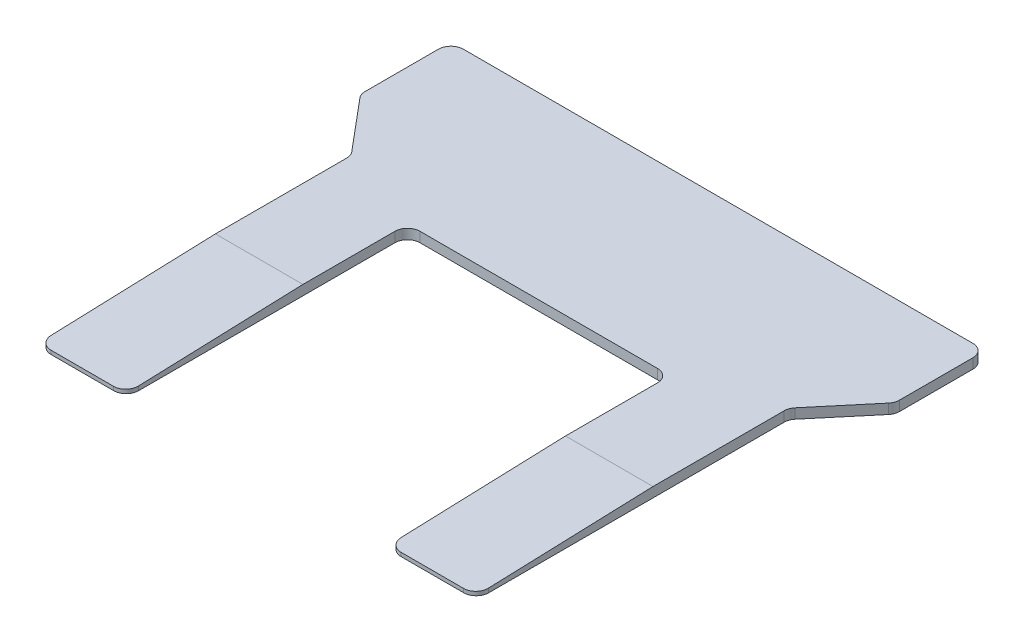
ISO-10303-21;
HEADER;
FILE_DESCRIPTION(('STEP AP214'),'2;1');
FILE_NAME('part.step','',(''),(''),'','','');
FILE_SCHEMA(('AUTOMOTIVE_DESIGN { 1 0 10303 214 1 1 1 1 }'));
ENDSEC;
DATA;
#1=APPLICATION_CONTEXT('core data for automotive mechanical design processes');
#2=APPLICATION_PROTOCOL_DEFINITION('international standard','automotive_design',2000,#1);
#3=PRODUCT_CONTEXT('',#1,'mechanical');
#4=PRODUCT('Part','Part','',(#3));
#5=PRODUCT_RELATED_PRODUCT_CATEGORY('part','',(#4));
#6=PRODUCT_DEFINITION_FORMATION('','',#4);
#7=PRODUCT_DEFINITION_CONTEXT('part definition',#1,'design');
#8=PRODUCT_DEFINITION('design','',#6,#7);
#9=PRODUCT_DEFINITION_SHAPE('','',#8);
#10=(LENGTH_UNIT() NAMED_UNIT(*) SI_UNIT(.MILLI.,.METRE.));
#11=(NAMED_UNIT(*) PLANE_ANGLE_UNIT() SI_UNIT($,.RADIAN.));
#12=(NAMED_UNIT(*) SI_UNIT($,.STERADIAN.) SOLID_ANGLE_UNIT());
#13=UNCERTAINTY_MEASURE_WITH_UNIT(LENGTH_MEASURE(1.E-05),#10,'distance_accuracy_value','');
#14=(GEOMETRIC_REPRESENTATION_CONTEXT(3) GLOBAL_UNCERTAINTY_ASSIGNED_CONTEXT((#13)) GLOBAL_UNIT_ASSIGNED_CONTEXT((#10,
#11,#12)) REPRESENTATION_CONTEXT('',''));
#15=CARTESIAN_POINT('',(0.,0.,0.));
#16=DIRECTION('',(0.,0.,1.));
#17=DIRECTION('',(1.,0.,0.));
#18=AXIS2_PLACEMENT_3D('',#15,#16,#17);
#19=CARTESIAN_POINT('',(-19.,1.5875,30.7));
#20=DIRECTION('',(0.,-1.,0.));
#21=DIRECTION('',(0.,0.,-1.));
#22=AXIS2_PLACEMENT_3D('',#19,#20,#21);
#23=CYLINDRICAL_SURFACE('',#22,2.);
#24=CARTESIAN_POINT('',(-19.,0.,30.7));
#25=DIRECTION('',(0.,-1.,0.));
#26=DIRECTION('',(0.,0.,-1.));
#27=AXIS2_PLACEMENT_3D('',#24,#25,#26);
#28=CIRCLE('',#27,2.);
#29=CARTESIAN_POINT('',(-21.,0.,30.7));
#30=VERTEX_POINT('',#29);
#31=CARTESIAN_POINT('',(-19.,0.,28.7));
#32=VERTEX_POINT('',#31);
#33=EDGE_CURVE('E336',#30,#32,#28,.T.);
#34=ORIENTED_EDGE('',*,*,#33,.T.);
#35=DIRECTION('',(0.,-1.,0.));
#36=VECTOR('',#35,1.);
#37=CARTESIAN_POINT('',(-19.,1.5875,28.7));
#38=LINE('',#37,#36);
#39=CARTESIAN_POINT('',(-19.,1.5875,28.7));
#40=VERTEX_POINT('',#39);
#41=EDGE_CURVE('E285',#40,#32,#38,.T.);
#42=ORIENTED_EDGE('',*,*,#41,.F.);
#43=CARTESIAN_POINT('',(-19.,1.5875,30.7));
#44=DIRECTION('',(0.,-1.,0.));
#45=DIRECTION('',(0.,0.,-1.));
#46=AXIS2_PLACEMENT_3D('',#43,#44,#45);
#47=CIRCLE('',#46,2.);
#48=CARTESIAN_POINT('',(-21.,1.5875,30.7));
#49=VERTEX_POINT('',#48);
#50=EDGE_CURVE('E390',#49,#40,#47,.T.);
#51=ORIENTED_EDGE('',*,*,#50,.F.);
#52=DIRECTION('',(0.,-1.,0.));
#53=VECTOR('',#52,1.);
#54=CARTESIAN_POINT('',(-21.,1.5875,30.7));
#55=LINE('',#54,#53);
#56=EDGE_CURVE('E335',#49,#30,#55,.T.);
#57=ORIENTED_EDGE('',*,*,#56,.T.);
#58=EDGE_LOOP('',(#34,#42,#51,#57));
#59=FACE_BOUND('',#58,.T.);
#60=ADVANCED_FACE('F35',(#59),#23,.F.);
#61=CARTESIAN_POINT('',(-19.,1.5875,28.7));
#62=DIRECTION('',(0.,0.,-1.));
#63=DIRECTION('',(-1.,0.,0.));
#64=AXIS2_PLACEMENT_3D('',#61,#62,#63);
#65=PLANE('',#64);
#66=DIRECTION('',(1.,0.,0.));
#67=VECTOR('',#66,1.);
#68=CARTESIAN_POINT('',(-19.,0.,28.7));
#69=LINE('',#68,#67);
#70=CARTESIAN_POINT('',(19.,0.,28.7));
#71=VERTEX_POINT('',#70);
#72=EDGE_CURVE('E338',#32,#71,#69,.T.);
#73=ORIENTED_EDGE('',*,*,#72,.T.);
#74=DIRECTION('',(0.,-1.,0.));
#75=VECTOR('',#74,1.);
#76=CARTESIAN_POINT('',(19.,1.5875,28.7));
#77=LINE('',#76,#75);
#78=CARTESIAN_POINT('',(19.,1.5875,28.7));
#79=VERTEX_POINT('',#78);
#80=EDGE_CURVE('E283',#79,#71,#77,.T.);
#81=ORIENTED_EDGE('',*,*,#80,.F.);
#82=DIRECTION('',(1.,0.,0.));
#83=VECTOR('',#82,1.);
#84=CARTESIAN_POINT('',(-19.,1.5875,28.7));
#85=LINE('',#84,#83);
#86=EDGE_CURVE('E423',#40,#79,#85,.T.);
#87=ORIENTED_EDGE('',*,*,#86,.F.);
#88=ORIENTED_EDGE('',*,*,#41,.T.);
#89=EDGE_LOOP('',(#73,#81,#87,#88));
#90=FACE_BOUND('',#89,.T.);
#91=ADVANCED_FACE('F513',(#90),#65,.F.);
#92=CARTESIAN_POINT('',(19.,1.5875,30.7));
#93=DIRECTION('',(0.,-1.,0.));
#94=DIRECTION('',(0.,0.,-1.));
#95=AXIS2_PLACEMENT_3D('',#92,#93,#94);
#96=CYLINDRICAL_SURFACE('',#95,2.);
#97=CARTESIAN_POINT('',(19.,0.,30.7));
#98=DIRECTION('',(0.,-1.,0.));
#99=DIRECTION('',(0.,0.,-1.));
#100=AXIS2_PLACEMENT_3D('',#97,#98,#99);
#101=CIRCLE('',#100,2.);
#102=CARTESIAN_POINT('',(21.,0.,30.7));
#103=VERTEX_POINT('',#102);
#104=EDGE_CURVE('E341',#71,#103,#101,.T.);
#105=ORIENTED_EDGE('',*,*,#104,.T.);
#106=DIRECTION('',(0.,-1.,0.));
#107=VECTOR('',#106,1.);
#108=CARTESIAN_POINT('',(21.,1.5875,30.7));
#109=LINE('',#108,#107);
#110=CARTESIAN_POINT('',(21.,1.5875,30.7));
#111=VERTEX_POINT('',#110);
#112=EDGE_CURVE('E280',#111,#103,#109,.T.);
#113=ORIENTED_EDGE('',*,*,#112,.F.);
#114=CARTESIAN_POINT('',(19.,1.5875,30.7));
#115=DIRECTION('',(0.,-1.,0.));
#116=DIRECTION('',(0.,0.,-1.));
#117=AXIS2_PLACEMENT_3D('',#114,#115,#116);
#118=CIRCLE('',#117,2.);
#119=EDGE_CURVE('E308',#79,#111,#118,.T.);
#120=ORIENTED_EDGE('',*,*,#119,.F.);
#121=ORIENTED_EDGE('',*,*,#80,.T.);
#122=EDGE_LOOP('',(#105,#113,#120,#121));
#123=FACE_BOUND('',#122,.T.);
#124=ADVANCED_FACE('F428',(#123),#96,.F.);
#125=CARTESIAN_POINT('',(21.,1.5875,30.7));
#126=DIRECTION('',(1.,0.,0.));
#127=DIRECTION('',(0.,0.,-1.));
#128=AXIS2_PLACEMENT_3D('',#125,#126,#127);
#129=PLANE('',#128);
#130=DIRECTION('',(0.,-1.,0.));
#131=VECTOR('',#130,1.);
#132=CARTESIAN_POINT('',(21.,1.5875,71.7));
#133=LINE('',#132,#131);
#134=CARTESIAN_POINT('',(21.,0.669841538983497,71.7));
#135=VERTEX_POINT('',#134);
#136=CARTESIAN_POINT('',(21.,0.,71.7));
#137=VERTEX_POINT('',#136);
#138=EDGE_CURVE('E278',#135,#137,#133,.T.);
#139=ORIENTED_EDGE('',*,*,#138,.F.);
#140=DIRECTION('',(0.,0.0348994967025017,-0.999390827019096));
#141=VECTOR('',#140,1.);
#142=CARTESIAN_POINT('',(21.,2.10096693568294,30.7179306605026));
#143=LINE('',#142,#141);
#144=CARTESIAN_POINT('',(21.,1.5875,45.4216998831214));
#145=VERTEX_POINT('',#144);
#146=EDGE_CURVE('E339',#135,#145,#143,.T.);
#147=ORIENTED_EDGE('',*,*,#146,.T.);
#148=DIRECTION('',(0.,0.,1.));
#149=VECTOR('',#148,1.);
#150=CARTESIAN_POINT('',(21.,1.5875,30.7));
#151=LINE('',#150,#149);
#152=EDGE_CURVE('E298',#111,#145,#151,.T.);
#153=ORIENTED_EDGE('',*,*,#152,.F.);
#154=ORIENTED_EDGE('',*,*,#112,.T.);
#155=DIRECTION('',(0.,0.,1.));
#156=VECTOR('',#155,1.);
#157=CARTESIAN_POINT('',(21.,0.,30.7));
#158=LINE('',#157,#156);
#159=EDGE_CURVE('E343',#103,#137,#158,.T.);
#160=ORIENTED_EDGE('',*,*,#159,.T.);
#161=EDGE_LOOP('',(#139,#147,#153,#154,#160));
#162=FACE_BOUND('',#161,.T.);
#163=ADVANCED_FACE('F432',(#162),#129,.F.);
#164=CARTESIAN_POINT('',(23.,1.5875,71.7));
#165=DIRECTION('',(0.,-1.,0.));
#166=DIRECTION('',(0.,0.,-1.));
#167=AXIS2_PLACEMENT_3D('',#164,#165,#166);
#168=CYLINDRICAL_SURFACE('',#167,2.);
#169=DIRECTION('',(0.,-1.,0.));
#170=VECTOR('',#169,1.);
#171=CARTESIAN_POINT('',(23.,1.5875,73.7));
#172=LINE('',#171,#170);
#173=CARTESIAN_POINT('',(23.,0.6,73.7));
#174=VERTEX_POINT('',#173);
#175=CARTESIAN_POINT('',(23.,0.,73.7));
#176=VERTEX_POINT('',#175);
#177=EDGE_CURVE('E276',#174,#176,#172,.T.);
#178=ORIENTED_EDGE('',*,*,#177,.F.);
#179=CARTESIAN_POINT('',(23.,0.669841538983497,71.7));
#180=DIRECTION('',(0.,-0.999390827019096,-0.0348994967025017));
#181=DIRECTION('',(0.,-0.0348994967025017,0.999390827019096));
#182=AXIS2_PLACEMENT_3D('',#179,#180,#181);
#183=ELLIPSE('',#182,2.00121908859765,2.);
#184=EDGE_CURVE('E418',#174,#135,#183,.T.);
#185=ORIENTED_EDGE('',*,*,#184,.T.);
#186=ORIENTED_EDGE('',*,*,#138,.T.);
#187=CARTESIAN_POINT('',(23.,0.,71.7));
#188=DIRECTION('',(0.,1.,0.));
#189=DIRECTION('',(0.,0.,1.));
#190=AXIS2_PLACEMENT_3D('',#187,#188,#189);
#191=CIRCLE('',#190,2.);
#192=EDGE_CURVE('E346',#137,#176,#191,.T.);
#193=ORIENTED_EDGE('',*,*,#192,.T.);
#194=EDGE_LOOP('',(#178,#185,#186,#193));
#195=FACE_BOUND('',#194,.T.);
#196=ADVANCED_FACE('F437',(#195),#168,.T.);
#197=CARTESIAN_POINT('',(23.,1.5875,73.7));
#198=DIRECTION('',(0.,0.,-1.));
#199=DIRECTION('',(-1.,0.,0.));
#200=AXIS2_PLACEMENT_3D('',#197,#198,#199);
#201=PLANE('',#200);
#202=DIRECTION('',(0.,-1.,0.));
#203=VECTOR('',#202,1.);
#204=CARTESIAN_POINT('',(33.,1.5875,73.7));
#205=LINE('',#204,#203);
#206=CARTESIAN_POINT('',(33.,0.6,73.7));
#207=VERTEX_POINT('',#206);
#208=CARTESIAN_POINT('',(33.,0.,73.7));
#209=VERTEX_POINT('',#208);
#210=EDGE_CURVE('E274',#207,#209,#205,.T.);
#211=ORIENTED_EDGE('',*,*,#210,.F.);
#212=DIRECTION('',(1.,0.,0.));
#213=VECTOR('',#212,1.);
#214=CARTESIAN_POINT('',(-42.75,0.6,73.7));
#215=LINE('',#214,#213);
#216=EDGE_CURVE('E223',#174,#207,#215,.T.);
#217=ORIENTED_EDGE('',*,*,#216,.F.);
#218=ORIENTED_EDGE('',*,*,#177,.T.);
#219=DIRECTION('',(1.,0.,0.));
#220=VECTOR('',#219,1.);
#221=CARTESIAN_POINT('',(23.,0.,73.7));
#222=LINE('',#221,#220);
#223=EDGE_CURVE('E349',#176,#209,#222,.T.);
#224=ORIENTED_EDGE('',*,*,#223,.T.);
#225=EDGE_LOOP('',(#211,#217,#218,#224));
#226=FACE_BOUND('',#225,.T.);
#227=ADVANCED_FACE('F442',(#226),#201,.F.);
#228=CARTESIAN_POINT('',(33.,1.5875,71.7));
#229=DIRECTION('',(0.,-1.,0.));
#230=DIRECTION('',(0.,0.,-1.));
#231=AXIS2_PLACEMENT_3D('',#228,#229,#230);
#232=CYLINDRICAL_SURFACE('',#231,2.);
#233=DIRECTION('',(0.,-1.,0.));
#234=VECTOR('',#233,1.);
#235=CARTESIAN_POINT('',(35.,1.5875,71.7));
#236=LINE('',#235,#234);
#237=CARTESIAN_POINT('',(35.,0.669841538983497,71.7));
#238=VERTEX_POINT('',#237);
#239=CARTESIAN_POINT('',(35.,0.,71.7));
#240=VERTEX_POINT('',#239);
#241=EDGE_CURVE('E272',#238,#240,#236,.T.);
#242=ORIENTED_EDGE('',*,*,#241,.F.);
#243=CARTESIAN_POINT('',(33.,0.669841538983497,71.7));
#244=DIRECTION('',(0.,-0.999390827019096,-0.0348994967025017));
#245=DIRECTION('',(0.,-0.0348994967025017,0.999390827019096));
#246=AXIS2_PLACEMENT_3D('',#243,#244,#245);
#247=ELLIPSE('',#246,2.00121908859765,2.);
#248=EDGE_CURVE('E412',#238,#207,#247,.T.);
#249=ORIENTED_EDGE('',*,*,#248,.T.);
#250=ORIENTED_EDGE('',*,*,#210,.T.);
#251=CARTESIAN_POINT('',(33.,0.,71.7));
#252=DIRECTION('',(0.,1.,0.));
#253=DIRECTION('',(0.,0.,1.));
#254=AXIS2_PLACEMENT_3D('',#251,#252,#253);
#255=CIRCLE('',#254,2.);
#256=EDGE_CURVE('E352',#209,#240,#255,.T.);
#257=ORIENTED_EDGE('',*,*,#256,.T.);
#258=EDGE_LOOP('',(#242,#249,#250,#257));
#259=FACE_BOUND('',#258,.T.);
#260=ADVANCED_FACE('F446',(#259),#232,.T.);
#261=CARTESIAN_POINT('',(35.,1.5875,71.7));
#262=DIRECTION('',(-1.,0.,0.));
#263=DIRECTION('',(0.,0.,1.));
#264=AXIS2_PLACEMENT_3D('',#261,#262,#263);
#265=PLANE('',#264);
#266=DIRECTION('',(0.,0.,-1.));
#267=VECTOR('',#266,1.);
#268=CARTESIAN_POINT('',(35.,1.5875,71.7));
#269=LINE('',#268,#267);
#270=CARTESIAN_POINT('',(35.,1.5875,45.4216998831215));
#271=VERTEX_POINT('',#270);
#272=CARTESIAN_POINT('',(35.,1.5875,24.4279404685324));
#273=VERTEX_POINT('',#272);
#274=EDGE_CURVE('E295',#271,#273,#269,.T.);
#275=ORIENTED_EDGE('',*,*,#274,.F.);
#276=DIRECTION('',(0.,-0.0348994967025017,0.999390827019096));
#277=VECTOR('',#276,1.);
#278=CARTESIAN_POINT('',(35.,0.670959223928339,71.667993690829));
#279=LINE('',#278,#277);
#280=EDGE_CURVE('E56',#271,#238,#279,.T.);
#281=ORIENTED_EDGE('',*,*,#280,.T.);
#282=ORIENTED_EDGE('',*,*,#241,.T.);
#283=DIRECTION('',(0.,0.,-1.));
#284=VECTOR('',#283,1.);
#285=CARTESIAN_POINT('',(35.,0.,71.7));
#286=LINE('',#285,#284);
#287=CARTESIAN_POINT('',(35.,0.,24.4279404685324));
#288=VERTEX_POINT('',#287);
#289=EDGE_CURVE('E355',#240,#288,#286,.T.);
#290=ORIENTED_EDGE('',*,*,#289,.T.);
#291=DIRECTION('',(0.,-1.,0.));
#292=VECTOR('',#291,1.);
#293=CARTESIAN_POINT('',(35.,1.5875,24.4279404685324));
#294=LINE('',#293,#292);
#295=EDGE_CURVE('E269',#273,#288,#294,.T.);
#296=ORIENTED_EDGE('',*,*,#295,.F.);
#297=EDGE_LOOP('',(#275,#281,#282,#290,#296));
#298=FACE_BOUND('',#297,.T.);
#299=ADVANCED_FACE('F301',(#298),#265,.F.);
#300=CARTESIAN_POINT('',(37.,1.5875,24.4279404685324));
#301=DIRECTION('',(0.,-1.,0.));
#302=DIRECTION('',(0.,0.,-1.));
#303=AXIS2_PLACEMENT_3D('',#300,#301,#302);
#304=CYLINDRICAL_SURFACE('',#303,2.);
#305=CARTESIAN_POINT('',(37.,0.,24.4279404685324));
#306=DIRECTION('',(0.,-1.,0.));
#307=DIRECTION('',(0.,0.,1.));
#308=AXIS2_PLACEMENT_3D('',#305,#306,#307);
#309=CIRCLE('',#308,2.);
#310=CARTESIAN_POINT('',(35.4679111137621,0.,23.1423652491593));
#311=VERTEX_POINT('',#310);
#312=EDGE_CURVE('E357',#288,#311,#309,.T.);
#313=ORIENTED_EDGE('',*,*,#312,.T.);
#314=DIRECTION('',(0.,-1.,0.));
#315=VECTOR('',#314,1.);
#316=CARTESIAN_POINT('',(35.4679111137621,1.5875,23.1423652491593));
#317=LINE('',#316,#315);
#318=CARTESIAN_POINT('',(35.4679111137621,1.5875,23.1423652491593));
#319=VERTEX_POINT('',#318);
#320=EDGE_CURVE('E266',#319,#311,#317,.T.);
#321=ORIENTED_EDGE('',*,*,#320,.F.);
#322=CARTESIAN_POINT('',(37.,1.5875,24.4279404685324));
#323=DIRECTION('',(0.,-1.,0.));
#324=DIRECTION('',(0.,0.,1.));
#325=AXIS2_PLACEMENT_3D('',#322,#323,#324);
#326=CIRCLE('',#325,2.);
#327=EDGE_CURVE('E304',#273,#319,#326,.T.);
#328=ORIENTED_EDGE('',*,*,#327,.F.);
#329=ORIENTED_EDGE('',*,*,#295,.T.);
#330=EDGE_LOOP('',(#313,#321,#328,#329));
#331=FACE_BOUND('',#330,.T.);
#332=ADVANCED_FACE('F450',(#331),#304,.F.);
#333=CARTESIAN_POINT('',(42.282088886238,1.5875,15.0215444082355));
#334=DIRECTION('',(-0.766044443118977,0.,-0.64278760968654));
#335=DIRECTION('',(-0.642787609686541,0.,0.766044443118977));
#336=AXIS2_PLACEMENT_3D('',#333,#334,#335);
#337=PLANE('',#336);
#338=DIRECTION('',(0.642787609686541,0.,-0.766044443118977));
#339=VECTOR('',#338,1.);
#340=CARTESIAN_POINT('',(42.282088886238,0.,15.0215444082355));
#341=LINE('',#340,#339);
#342=CARTESIAN_POINT('',(42.282088886238,0.,15.0215444082355));
#343=VERTEX_POINT('',#342);
#344=EDGE_CURVE('E359',#311,#343,#341,.T.);
#345=ORIENTED_EDGE('',*,*,#344,.T.);
#346=DIRECTION('',(0.,-1.,0.));
#347=VECTOR('',#346,1.);
#348=CARTESIAN_POINT('',(42.282088886238,1.5875,15.0215444082355));
#349=LINE('',#348,#347);
#350=CARTESIAN_POINT('',(42.282088886238,1.5875,15.0215444082355));
#351=VERTEX_POINT('',#350);
#352=EDGE_CURVE('E263',#351,#343,#349,.T.);
#353=ORIENTED_EDGE('',*,*,#352,.F.);
#354=DIRECTION('',(0.642787609686541,0.,-0.766044443118977));
#355=VECTOR('',#354,1.);
#356=CARTESIAN_POINT('',(42.282088886238,1.5875,15.0215444082355));
#357=LINE('',#356,#355);
#358=EDGE_CURVE('E306',#319,#351,#357,.T.);
#359=ORIENTED_EDGE('',*,*,#358,.F.);
#360=ORIENTED_EDGE('',*,*,#320,.T.);
#361=EDGE_LOOP('',(#345,#353,#359,#360));
#362=FACE_BOUND('',#361,.T.);
#363=ADVANCED_FACE('F457',(#362),#337,.F.);
#364=CARTESIAN_POINT('',(40.75,1.5875,13.7359691888625));
#365=DIRECTION('',(0.,-1.,0.));
#366=DIRECTION('',(0.,0.,-1.));
#367=AXIS2_PLACEMENT_3D('',#364,#365,#366);
#368=CYLINDRICAL_SURFACE('',#367,2.);
#369=CARTESIAN_POINT('',(40.75,0.,13.7359691888625));
#370=DIRECTION('',(0.,1.,0.));
#371=DIRECTION('',(0.,0.,-1.));
#372=AXIS2_PLACEMENT_3D('',#369,#370,#371);
#373=CIRCLE('',#372,2.);
#374=CARTESIAN_POINT('',(42.75,0.,13.7359691888625));
#375=VERTEX_POINT('',#374);
#376=EDGE_CURVE('E361',#343,#375,#373,.T.);
#377=ORIENTED_EDGE('',*,*,#376,.T.);
#378=DIRECTION('',(0.,-1.,0.));
#379=VECTOR('',#378,1.);
#380=CARTESIAN_POINT('',(42.75,1.5875,13.7359691888625));
#381=LINE('',#380,#379);
#382=CARTESIAN_POINT('',(42.75,1.5875,13.7359691888625));
#383=VERTEX_POINT('',#382);
#384=EDGE_CURVE('E260',#383,#375,#381,.T.);
#385=ORIENTED_EDGE('',*,*,#384,.F.);
#386=CARTESIAN_POINT('',(40.75,1.5875,13.7359691888625));
#387=DIRECTION('',(0.,1.,0.));
#388=DIRECTION('',(0.,0.,-1.));
#389=AXIS2_PLACEMENT_3D('',#386,#387,#388);
#390=CIRCLE('',#389,2.);
#391=EDGE_CURVE('E313',#351,#383,#390,.T.);
#392=ORIENTED_EDGE('',*,*,#391,.F.);
#393=ORIENTED_EDGE('',*,*,#352,.T.);
#394=EDGE_LOOP('',(#377,#385,#392,#393));
#395=FACE_BOUND('',#394,.T.);
#396=ADVANCED_FACE('F461',(#395),#368,.T.);
#397=CARTESIAN_POINT('',(42.75,1.5875,2.));
#398=DIRECTION('',(-1.,0.,0.));
#399=DIRECTION('',(0.,0.,1.));
#400=AXIS2_PLACEMENT_3D('',#397,#398,#399);
#401=PLANE('',#400);
#402=DIRECTION('',(0.,0.,-1.));
#403=VECTOR('',#402,1.);
#404=CARTESIAN_POINT('',(42.75,0.,2.));
#405=LINE('',#404,#403);
#406=CARTESIAN_POINT('',(42.75,0.,2.));
#407=VERTEX_POINT('',#406);
#408=EDGE_CURVE('E363',#375,#407,#405,.T.);
#409=ORIENTED_EDGE('',*,*,#408,.T.);
#410=DIRECTION('',(0.,-1.,0.));
#411=VECTOR('',#410,1.);
#412=CARTESIAN_POINT('',(42.75,1.5875,2.));
#413=LINE('',#412,#411);
#414=CARTESIAN_POINT('',(42.75,1.5875,2.));
#415=VERTEX_POINT('',#414);
#416=EDGE_CURVE('E257',#415,#407,#413,.T.);
#417=ORIENTED_EDGE('',*,*,#416,.F.);
#418=DIRECTION('',(0.,0.,-1.));
#419=VECTOR('',#418,1.);
#420=CARTESIAN_POINT('',(42.75,1.5875,2.));
#421=LINE('',#420,#419);
#422=EDGE_CURVE('E315',#383,#415,#421,.T.);
#423=ORIENTED_EDGE('',*,*,#422,.F.);
#424=ORIENTED_EDGE('',*,*,#384,.T.);
#425=EDGE_LOOP('',(#409,#417,#423,#424));
#426=FACE_BOUND('',#425,.T.);
#427=ADVANCED_FACE('F468',(#426),#401,.F.);
#428=CARTESIAN_POINT('',(40.75,1.5875,2.));
#429=DIRECTION('',(0.,-1.,0.));
#430=DIRECTION('',(0.,0.,-1.));
#431=AXIS2_PLACEMENT_3D('',#428,#429,#430);
#432=CYLINDRICAL_SURFACE('',#431,2.);
#433=CARTESIAN_POINT('',(40.75,0.,2.));
#434=DIRECTION('',(0.,1.,0.));
#435=DIRECTION('',(0.,0.,-1.));
#436=AXIS2_PLACEMENT_3D('',#433,#434,#435);
#437=CIRCLE('',#436,2.);
#438=CARTESIAN_POINT('',(40.75,0.,0.));
#439=VERTEX_POINT('',#438);
#440=EDGE_CURVE('E365',#407,#439,#437,.T.);
#441=ORIENTED_EDGE('',*,*,#440,.T.);
#442=DIRECTION('',(0.,-1.,0.));
#443=VECTOR('',#442,1.);
#444=CARTESIAN_POINT('',(40.75,1.5875,0.));
#445=LINE('',#444,#443);
#446=CARTESIAN_POINT('',(40.75,1.5875,0.));
#447=VERTEX_POINT('',#446);
#448=EDGE_CURVE('E254',#447,#439,#445,.T.);
#449=ORIENTED_EDGE('',*,*,#448,.F.);
#450=CARTESIAN_POINT('',(40.75,1.5875,2.));
#451=DIRECTION('',(0.,1.,0.));
#452=DIRECTION('',(0.,0.,-1.));
#453=AXIS2_PLACEMENT_3D('',#450,#451,#452);
#454=CIRCLE('',#453,2.);
#455=EDGE_CURVE('E317',#415,#447,#454,.T.);
#456=ORIENTED_EDGE('',*,*,#455,.F.);
#457=ORIENTED_EDGE('',*,*,#416,.T.);
#458=EDGE_LOOP('',(#441,#449,#456,#457));
#459=FACE_BOUND('',#458,.T.);
#460=ADVANCED_FACE('F471',(#459),#432,.T.);
#461=CARTESIAN_POINT('',(-40.75,1.5875,0.));
#462=DIRECTION('',(0.,0.,1.));
#463=DIRECTION('',(1.,0.,0.));
#464=AXIS2_PLACEMENT_3D('',#461,#462,#463);
#465=PLANE('',#464);
#466=DIRECTION('',(-1.,0.,0.));
#467=VECTOR('',#466,1.);
#468=CARTESIAN_POINT('',(-40.75,0.,0.));
#469=LINE('',#468,#467);
#470=CARTESIAN_POINT('',(-40.75,0.,0.));
#471=VERTEX_POINT('',#470);
#472=EDGE_CURVE('E367',#439,#471,#469,.T.);
#473=ORIENTED_EDGE('',*,*,#472,.T.);
#474=DIRECTION('',(0.,-1.,0.));
#475=VECTOR('',#474,1.);
#476=CARTESIAN_POINT('',(-40.75,1.5875,0.));
#477=LINE('',#476,#475);
#478=CARTESIAN_POINT('',(-40.75,1.5875,0.));
#479=VERTEX_POINT('',#478);
#480=EDGE_CURVE('E251',#479,#471,#477,.T.);
#481=ORIENTED_EDGE('',*,*,#480,.F.);
#482=DIRECTION('',(-1.,0.,0.));
#483=VECTOR('',#482,1.);
#484=CARTESIAN_POINT('',(-40.75,1.5875,0.));
#485=LINE('',#484,#483);
#486=EDGE_CURVE('E319',#447,#479,#485,.T.);
#487=ORIENTED_EDGE('',*,*,#486,.F.);
#488=ORIENTED_EDGE('',*,*,#448,.T.);
#489=EDGE_LOOP('',(#473,#481,#487,#488));
#490=FACE_BOUND('',#489,.T.);
#491=ADVANCED_FACE('F476',(#490),#465,.F.);
#492=CARTESIAN_POINT('',(-40.75,1.5875,2.));
#493=DIRECTION('',(0.,-1.,0.));
#494=DIRECTION('',(0.,0.,-1.));
#495=AXIS2_PLACEMENT_3D('',#492,#493,#494);
#496=CYLINDRICAL_SURFACE('',#495,2.);
#497=CARTESIAN_POINT('',(-40.75,0.,2.));
#498=DIRECTION('',(0.,1.,0.));
#499=DIRECTION('',(0.,0.,-1.));
#500=AXIS2_PLACEMENT_3D('',#497,#498,#499);
#501=CIRCLE('',#500,2.);
#502=CARTESIAN_POINT('',(-42.75,0.,2.));
#503=VERTEX_POINT('',#502);
#504=EDGE_CURVE('E369',#471,#503,#501,.T.);
#505=ORIENTED_EDGE('',*,*,#504,.T.);
#506=DIRECTION('',(0.,-1.,0.));
#507=VECTOR('',#506,1.);
#508=CARTESIAN_POINT('',(-42.75,1.5875,2.));
#509=LINE('',#508,#507);
#510=CARTESIAN_POINT('',(-42.75,1.5875,2.));
#511=VERTEX_POINT('',#510);
#512=EDGE_CURVE('E248',#511,#503,#509,.T.);
#513=ORIENTED_EDGE('',*,*,#512,.F.);
#514=CARTESIAN_POINT('',(-40.75,1.5875,2.));
#515=DIRECTION('',(0.,1.,0.));
#516=DIRECTION('',(0.,0.,-1.));
#517=AXIS2_PLACEMENT_3D('',#514,#515,#516);
#518=CIRCLE('',#517,2.);
#519=EDGE_CURVE('E321',#479,#511,#518,.T.);
#520=ORIENTED_EDGE('',*,*,#519,.F.);
#521=ORIENTED_EDGE('',*,*,#480,.T.);
#522=EDGE_LOOP('',(#505,#513,#520,#521));
#523=FACE_BOUND('',#522,.T.);
#524=ADVANCED_FACE('F482',(#523),#496,.T.);
#525=CARTESIAN_POINT('',(-42.75,1.5875,13.7359691888625));
#526=DIRECTION('',(1.,0.,0.));
#527=DIRECTION('',(0.,0.,-1.));
#528=AXIS2_PLACEMENT_3D('',#525,#526,#527);
#529=PLANE('',#528);
#530=DIRECTION('',(0.,0.,1.));
#531=VECTOR('',#530,1.);
#532=CARTESIAN_POINT('',(-42.75,0.,13.7359691888625));
#533=LINE('',#532,#531);
#534=CARTESIAN_POINT('',(-42.75,0.,13.7359691888625));
#535=VERTEX_POINT('',#534);
#536=EDGE_CURVE('E371',#503,#535,#533,.T.);
#537=ORIENTED_EDGE('',*,*,#536,.T.);
#538=DIRECTION('',(0.,-1.,0.));
#539=VECTOR('',#538,1.);
#540=CARTESIAN_POINT('',(-42.75,1.5875,13.7359691888625));
#541=LINE('',#540,#539);
#542=CARTESIAN_POINT('',(-42.75,1.5875,13.7359691888625));
#543=VERTEX_POINT('',#542);
#544=EDGE_CURVE('E245',#543,#535,#541,.T.);
#545=ORIENTED_EDGE('',*,*,#544,.F.);
#546=DIRECTION('',(0.,0.,1.));
#547=VECTOR('',#546,1.);
#548=CARTESIAN_POINT('',(-42.75,1.5875,13.7359691888625));
#549=LINE('',#548,#547);
#550=EDGE_CURVE('E323',#511,#543,#549,.T.);
#551=ORIENTED_EDGE('',*,*,#550,.F.);
#552=ORIENTED_EDGE('',*,*,#512,.T.);
#553=EDGE_LOOP('',(#537,#545,#551,#552));
#554=FACE_BOUND('',#553,.T.);
#555=ADVANCED_FACE('F486',(#554),#529,.F.);
#556=CARTESIAN_POINT('',(-40.75,1.5875,13.7359691888625));
#557=DIRECTION('',(0.,-1.,0.));
#558=DIRECTION('',(0.,0.,-1.));
#559=AXIS2_PLACEMENT_3D('',#556,#557,#558);
#560=CYLINDRICAL_SURFACE('',#559,2.);
#561=CARTESIAN_POINT('',(-40.75,0.,13.7359691888625));
#562=DIRECTION('',(0.,1.,0.));
#563=DIRECTION('',(0.,0.,-1.));
#564=AXIS2_PLACEMENT_3D('',#561,#562,#563);
#565=CIRCLE('',#564,2.);
#566=CARTESIAN_POINT('',(-42.282088886238,0.,15.0215444082355));
#567=VERTEX_POINT('',#566);
#568=EDGE_CURVE('E373',#535,#567,#565,.T.);
#569=ORIENTED_EDGE('',*,*,#568,.T.);
#570=DIRECTION('',(0.,-1.,0.));
#571=VECTOR('',#570,1.);
#572=CARTESIAN_POINT('',(-42.282088886238,1.5875,15.0215444082355));
#573=LINE('',#572,#571);
#574=CARTESIAN_POINT('',(-42.282088886238,1.5875,15.0215444082355));
#575=VERTEX_POINT('',#574);
#576=EDGE_CURVE('E242',#575,#567,#573,.T.);
#577=ORIENTED_EDGE('',*,*,#576,.F.);
#578=CARTESIAN_POINT('',(-40.75,1.5875,13.7359691888625));
#579=DIRECTION('',(0.,1.,0.));
#580=DIRECTION('',(0.,0.,-1.));
#581=AXIS2_PLACEMENT_3D('',#578,#579,#580);
#582=CIRCLE('',#581,2.);
#583=EDGE_CURVE('E325',#543,#575,#582,.T.);
#584=ORIENTED_EDGE('',*,*,#583,.F.);
#585=ORIENTED_EDGE('',*,*,#544,.T.);
#586=EDGE_LOOP('',(#569,#577,#584,#585));
#587=FACE_BOUND('',#586,.T.);
#588=ADVANCED_FACE('F491',(#587),#560,.T.);
#589=CARTESIAN_POINT('',(-35.4679111137621,1.5875,23.1423652491593));
#590=DIRECTION('',(0.766044443118977,0.,-0.64278760968654));
#591=DIRECTION('',(-0.64278760968654,0.,-0.766044443118977));
#592=AXIS2_PLACEMENT_3D('',#589,#590,#591);
#593=PLANE('',#592);
#594=DIRECTION('',(0.64278760968654,0.,0.766044443118977));
#595=VECTOR('',#594,1.);
#596=CARTESIAN_POINT('',(-35.4679111137621,0.,23.1423652491593));
#597=LINE('',#596,#595);
#598=CARTESIAN_POINT('',(-35.4679111137621,0.,23.1423652491593));
#599=VERTEX_POINT('',#598);
#600=EDGE_CURVE('E375',#567,#599,#597,.T.);
#601=ORIENTED_EDGE('',*,*,#600,.T.);
#602=DIRECTION('',(0.,-1.,0.));
#603=VECTOR('',#602,1.);
#604=CARTESIAN_POINT('',(-35.4679111137621,1.5875,23.1423652491593));
#605=LINE('',#604,#603);
#606=CARTESIAN_POINT('',(-35.4679111137621,1.5875,23.1423652491593));
#607=VERTEX_POINT('',#606);
#608=EDGE_CURVE('E239',#607,#599,#605,.T.);
#609=ORIENTED_EDGE('',*,*,#608,.F.);
#610=DIRECTION('',(0.64278760968654,0.,0.766044443118977));
#611=VECTOR('',#610,1.);
#612=CARTESIAN_POINT('',(-35.4679111137621,1.5875,23.1423652491593));
#613=LINE('',#612,#611);
#614=EDGE_CURVE('E327',#575,#607,#613,.T.);
#615=ORIENTED_EDGE('',*,*,#614,.F.);
#616=ORIENTED_EDGE('',*,*,#576,.T.);
#617=EDGE_LOOP('',(#601,#609,#615,#616));
#618=FACE_BOUND('',#617,.T.);
#619=ADVANCED_FACE('F497',(#618),#593,.F.);
#620=CARTESIAN_POINT('',(-37.,1.5875,24.4279404685324));
#621=DIRECTION('',(0.,-1.,0.));
#622=DIRECTION('',(0.,0.,-1.));
#623=AXIS2_PLACEMENT_3D('',#620,#621,#622);
#624=CYLINDRICAL_SURFACE('',#623,2.);
#625=CARTESIAN_POINT('',(-37.,0.,24.4279404685324));
#626=DIRECTION('',(0.,-1.,0.));
#627=DIRECTION('',(0.,0.,-1.));
#628=AXIS2_PLACEMENT_3D('',#625,#626,#627);
#629=CIRCLE('',#628,2.);
#630=CARTESIAN_POINT('',(-35.,0.,24.4279404685324));
#631=VERTEX_POINT('',#630);
#632=EDGE_CURVE('E377',#599,#631,#629,.T.);
#633=ORIENTED_EDGE('',*,*,#632,.T.);
#634=DIRECTION('',(0.,-1.,0.));
#635=VECTOR('',#634,1.);
#636=CARTESIAN_POINT('',(-35.,1.5875,24.4279404685324));
#637=LINE('',#636,#635);
#638=CARTESIAN_POINT('',(-35.,1.5875,24.4279404685324));
#639=VERTEX_POINT('',#638);
#640=EDGE_CURVE('E231',#639,#631,#637,.T.);
#641=ORIENTED_EDGE('',*,*,#640,.F.);
#642=CARTESIAN_POINT('',(-37.,1.5875,24.4279404685324));
#643=DIRECTION('',(0.,-1.,0.));
#644=DIRECTION('',(0.,0.,-1.));
#645=AXIS2_PLACEMENT_3D('',#642,#643,#644);
#646=CIRCLE('',#645,2.);
#647=EDGE_CURVE('E329',#607,#639,#646,.T.);
#648=ORIENTED_EDGE('',*,*,#647,.F.);
#649=ORIENTED_EDGE('',*,*,#608,.T.);
#650=EDGE_LOOP('',(#633,#641,#648,#649));
#651=FACE_BOUND('',#650,.T.);
#652=ADVANCED_FACE('F501',(#651),#624,.F.);
#653=CARTESIAN_POINT('',(-35.,1.5875,24.4279404685324));
#654=DIRECTION('',(1.,0.,0.));
#655=DIRECTION('',(0.,0.,-1.));
#656=AXIS2_PLACEMENT_3D('',#653,#654,#655);
#657=PLANE('',#656);
#658=DIRECTION('',(0.,-1.,0.));
#659=VECTOR('',#658,1.);
#660=CARTESIAN_POINT('',(-35.,1.5875,71.7));
#661=LINE('',#660,#659);
#662=CARTESIAN_POINT('',(-35.,0.669841538983497,71.7));
#663=VERTEX_POINT('',#662);
#664=CARTESIAN_POINT('',(-35.,0.,71.7));
#665=VERTEX_POINT('',#664);
#666=EDGE_CURVE('E229',#663,#665,#661,.T.);
#667=ORIENTED_EDGE('',*,*,#666,.F.);
#668=DIRECTION('',(0.,0.0348994967025017,-0.999390827019096));
#669=VECTOR('',#668,1.);
#670=CARTESIAN_POINT('',(-35.,2.31972531369715,24.453510339928));
#671=LINE('',#670,#669);
#672=CARTESIAN_POINT('',(-35.,1.5875,45.4216998831215));
#673=VERTEX_POINT('',#672);
#674=EDGE_CURVE('E210',#663,#673,#671,.T.);
#675=ORIENTED_EDGE('',*,*,#674,.T.);
#676=DIRECTION('',(0.,0.,1.));
#677=VECTOR('',#676,1.);
#678=CARTESIAN_POINT('',(-35.,1.5875,24.4279404685324));
#679=LINE('',#678,#677);
#680=EDGE_CURVE('E331',#639,#673,#679,.T.);
#681=ORIENTED_EDGE('',*,*,#680,.F.);
#682=ORIENTED_EDGE('',*,*,#640,.T.);
#683=DIRECTION('',(0.,0.,1.));
#684=VECTOR('',#683,1.);
#685=CARTESIAN_POINT('',(-35.,0.,24.4279404685324));
#686=LINE('',#685,#684);
#687=EDGE_CURVE('E379',#631,#665,#686,.T.);
#688=ORIENTED_EDGE('',*,*,#687,.T.);
#689=EDGE_LOOP('',(#667,#675,#681,#682,#688));
#690=FACE_BOUND('',#689,.T.);
#691=ADVANCED_FACE('F410',(#690),#657,.F.);
#692=CARTESIAN_POINT('',(-33.,1.5875,71.7));
#693=DIRECTION('',(0.,-1.,0.));
#694=DIRECTION('',(0.,0.,-1.));
#695=AXIS2_PLACEMENT_3D('',#692,#693,#694);
#696=CYLINDRICAL_SURFACE('',#695,2.);
#697=DIRECTION('',(0.,-1.,0.));
#698=VECTOR('',#697,1.);
#699=CARTESIAN_POINT('',(-33.,1.5875,73.7));
#700=LINE('',#699,#698);
#701=CARTESIAN_POINT('',(-33.,0.6,73.7));
#702=VERTEX_POINT('',#701);
#703=CARTESIAN_POINT('',(-33.,0.,73.7));
#704=VERTEX_POINT('',#703);
#705=EDGE_CURVE('E220',#702,#704,#700,.T.);
#706=ORIENTED_EDGE('',*,*,#705,.F.);
#707=CARTESIAN_POINT('',(-33.,0.669841538983497,71.7));
#708=DIRECTION('',(0.,-0.999390827019096,-0.0348994967025017));
#709=DIRECTION('',(0.,-0.0348994967025017,0.999390827019096));
#710=AXIS2_PLACEMENT_3D('',#707,#708,#709);
#711=ELLIPSE('',#710,2.00121908859765,2.);
#712=EDGE_CURVE('E204',#702,#663,#711,.T.);
#713=ORIENTED_EDGE('',*,*,#712,.T.);
#714=ORIENTED_EDGE('',*,*,#666,.T.);
#715=CARTESIAN_POINT('',(-33.,0.,71.7));
#716=DIRECTION('',(0.,1.,0.));
#717=DIRECTION('',(0.,0.,1.));
#718=AXIS2_PLACEMENT_3D('',#715,#716,#717);
#719=CIRCLE('',#718,2.);
#720=EDGE_CURVE('E227',#665,#704,#719,.T.);
#721=ORIENTED_EDGE('',*,*,#720,.T.);
#722=EDGE_LOOP('',(#706,#713,#714,#721));
#723=FACE_BOUND('',#722,.T.);
#724=ADVANCED_FACE('F225',(#723),#696,.T.);
#725=CARTESIAN_POINT('',(-33.,1.5875,73.7));
#726=DIRECTION('',(0.,0.,-1.));
#727=DIRECTION('',(-1.,0.,0.));
#728=AXIS2_PLACEMENT_3D('',#725,#726,#727);
#729=PLANE('',#728);
#730=DIRECTION('',(0.,-1.,0.));
#731=VECTOR('',#730,1.);
#732=CARTESIAN_POINT('',(-23.,1.5875,73.7));
#733=LINE('',#732,#731);
#734=CARTESIAN_POINT('',(-23.,0.6,73.7));
#735=VERTEX_POINT('',#734);
#736=CARTESIAN_POINT('',(-23.,0.,73.7));
#737=VERTEX_POINT('',#736);
#738=EDGE_CURVE('E222',#735,#737,#733,.T.);
#739=ORIENTED_EDGE('',*,*,#738,.F.);
#740=EDGE_CURVE('E207',#702,#735,#215,.T.);
#741=ORIENTED_EDGE('',*,*,#740,.F.);
#742=ORIENTED_EDGE('',*,*,#705,.T.);
#743=DIRECTION('',(1.,0.,0.));
#744=VECTOR('',#743,1.);
#745=CARTESIAN_POINT('',(-33.,0.,73.7));
#746=LINE('',#745,#744);
#747=EDGE_CURVE('E383',#704,#737,#746,.T.);
#748=ORIENTED_EDGE('',*,*,#747,.T.);
#749=EDGE_LOOP('',(#739,#741,#742,#748));
#750=FACE_BOUND('',#749,.T.);
#751=ADVANCED_FACE('F218',(#750),#729,.F.);
#752=CARTESIAN_POINT('',(-23.,1.5875,71.7));
#753=DIRECTION('',(0.,-1.,0.));
#754=DIRECTION('',(0.,0.,-1.));
#755=AXIS2_PLACEMENT_3D('',#752,#753,#754);
#756=CYLINDRICAL_SURFACE('',#755,2.);
#757=DIRECTION('',(0.,-1.,0.));
#758=VECTOR('',#757,1.);
#759=CARTESIAN_POINT('',(-21.,1.5875,71.7));
#760=LINE('',#759,#758);
#761=CARTESIAN_POINT('',(-21.,0.669841538983497,71.7));
#762=VERTEX_POINT('',#761);
#763=CARTESIAN_POINT('',(-21.,0.,71.7));
#764=VERTEX_POINT('',#763);
#765=EDGE_CURVE('E233',#762,#764,#760,.T.);
#766=ORIENTED_EDGE('',*,*,#765,.F.);
#767=CARTESIAN_POINT('',(-23.,0.669841538983497,71.7));
#768=DIRECTION('',(0.,-0.999390827019096,-0.0348994967025017));
#769=DIRECTION('',(0.,-0.0348994967025017,0.999390827019096));
#770=AXIS2_PLACEMENT_3D('',#767,#768,#769);
#771=ELLIPSE('',#770,2.00121908859765,2.);
#772=EDGE_CURVE('E214',#762,#735,#771,.T.);
#773=ORIENTED_EDGE('',*,*,#772,.T.);
#774=ORIENTED_EDGE('',*,*,#738,.T.);
#775=CARTESIAN_POINT('',(-23.,0.,71.7));
#776=DIRECTION('',(0.,1.,0.));
#777=DIRECTION('',(0.,0.,-1.));
#778=AXIS2_PLACEMENT_3D('',#775,#776,#777);
#779=CIRCLE('',#778,2.);
#780=EDGE_CURVE('E385',#737,#764,#779,.T.);
#781=ORIENTED_EDGE('',*,*,#780,.T.);
#782=EDGE_LOOP('',(#766,#773,#774,#781));
#783=FACE_BOUND('',#782,.T.);
#784=ADVANCED_FACE('F400',(#783),#756,.T.);
#785=CARTESIAN_POINT('',(-21.,1.5875,71.7));
#786=DIRECTION('',(-1.,0.,0.));
#787=DIRECTION('',(0.,0.,1.));
#788=AXIS2_PLACEMENT_3D('',#785,#786,#787);
#789=PLANE('',#788);
#790=DIRECTION('',(0.,0.,-1.));
#791=VECTOR('',#790,1.);
#792=CARTESIAN_POINT('',(-21.,1.5875,71.7));
#793=LINE('',#792,#791);
#794=CARTESIAN_POINT('',(-21.,1.5875,45.4216998831214));
#795=VERTEX_POINT('',#794);
#796=EDGE_CURVE('E333',#795,#49,#793,.T.);
#797=ORIENTED_EDGE('',*,*,#796,.F.);
#798=DIRECTION('',(0.,-0.0348994967025017,0.999390827019096));
#799=VECTOR('',#798,1.);
#800=CARTESIAN_POINT('',(-21.,0.670959223928339,71.667993690829));
#801=LINE('',#800,#799);
#802=EDGE_CURVE('E49',#795,#762,#801,.T.);
#803=ORIENTED_EDGE('',*,*,#802,.T.);
#804=ORIENTED_EDGE('',*,*,#765,.T.);
#805=DIRECTION('',(0.,0.,-1.));
#806=VECTOR('',#805,1.);
#807=CARTESIAN_POINT('',(-21.,0.,71.7));
#808=LINE('',#807,#806);
#809=EDGE_CURVE('E388',#764,#30,#808,.T.);
#810=ORIENTED_EDGE('',*,*,#809,.T.);
#811=ORIENTED_EDGE('',*,*,#56,.F.);
#812=EDGE_LOOP('',(#797,#803,#804,#810,#811));
#813=FACE_BOUND('',#812,.T.);
#814=ADVANCED_FACE('F395',(#813),#789,.F.);
#815=CARTESIAN_POINT('',(-19.,1.5875,30.7));
#816=DIRECTION('',(0.,-1.,0.));
#817=DIRECTION('',(0.,0.,-1.));
#818=AXIS2_PLACEMENT_3D('',#815,#816,#817);
#819=PLANE('',#818);
#820=ORIENTED_EDGE('',*,*,#680,.T.);
#821=DIRECTION('',(1.,0.,0.));
#822=VECTOR('',#821,1.);
#823=CARTESIAN_POINT('',(-19.,1.5875,45.4216998831214));
#824=LINE('',#823,#822);
#825=EDGE_CURVE('E11',#673,#795,#824,.T.);
#826=ORIENTED_EDGE('',*,*,#825,.T.);
#827=ORIENTED_EDGE('',*,*,#796,.T.);
#828=ORIENTED_EDGE('',*,*,#50,.T.);
#829=ORIENTED_EDGE('',*,*,#86,.T.);
#830=ORIENTED_EDGE('',*,*,#119,.T.);
#831=ORIENTED_EDGE('',*,*,#152,.T.);
#832=EDGE_CURVE('E38',#145,#271,#824,.T.);
#833=ORIENTED_EDGE('',*,*,#832,.T.);
#834=ORIENTED_EDGE('',*,*,#274,.T.);
#835=ORIENTED_EDGE('',*,*,#327,.T.);
#836=ORIENTED_EDGE('',*,*,#358,.T.);
#837=ORIENTED_EDGE('',*,*,#391,.T.);
#838=ORIENTED_EDGE('',*,*,#422,.T.);
#839=ORIENTED_EDGE('',*,*,#455,.T.);
#840=ORIENTED_EDGE('',*,*,#486,.T.);
#841=ORIENTED_EDGE('',*,*,#519,.T.);
#842=ORIENTED_EDGE('',*,*,#550,.T.);
#843=ORIENTED_EDGE('',*,*,#583,.T.);
#844=ORIENTED_EDGE('',*,*,#614,.T.);
#845=ORIENTED_EDGE('',*,*,#647,.T.);
#846=EDGE_LOOP('',(#820,#826,#827,#828,#829,#830,#831,#833,#834,#835,#836,#837,#838,#839,#840,
#841,#842,#843,#844,#845));
#847=FACE_BOUND('',#846,.T.);
#848=ADVANCED_FACE('F294',(#847),#819,.F.);
#849=CARTESIAN_POINT('',(-19.,0.,30.7));
#850=DIRECTION('',(0.,-1.,0.));
#851=DIRECTION('',(0.,0.,-1.));
#852=AXIS2_PLACEMENT_3D('',#849,#850,#851);
#853=PLANE('',#852);
#854=ORIENTED_EDGE('',*,*,#33,.F.);
#855=ORIENTED_EDGE('',*,*,#809,.F.);
#856=ORIENTED_EDGE('',*,*,#780,.F.);
#857=ORIENTED_EDGE('',*,*,#747,.F.);
#858=ORIENTED_EDGE('',*,*,#720,.F.);
#859=ORIENTED_EDGE('',*,*,#687,.F.);
#860=ORIENTED_EDGE('',*,*,#632,.F.);
#861=ORIENTED_EDGE('',*,*,#600,.F.);
#862=ORIENTED_EDGE('',*,*,#568,.F.);
#863=ORIENTED_EDGE('',*,*,#536,.F.);
#864=ORIENTED_EDGE('',*,*,#504,.F.);
#865=ORIENTED_EDGE('',*,*,#472,.F.);
#866=ORIENTED_EDGE('',*,*,#440,.F.);
#867=ORIENTED_EDGE('',*,*,#408,.F.);
#868=ORIENTED_EDGE('',*,*,#376,.F.);
#869=ORIENTED_EDGE('',*,*,#344,.F.);
#870=ORIENTED_EDGE('',*,*,#312,.F.);
#871=ORIENTED_EDGE('',*,*,#289,.F.);
#872=ORIENTED_EDGE('',*,*,#256,.F.);
#873=ORIENTED_EDGE('',*,*,#223,.F.);
#874=ORIENTED_EDGE('',*,*,#192,.F.);
#875=ORIENTED_EDGE('',*,*,#159,.F.);
#876=ORIENTED_EDGE('',*,*,#104,.F.);
#877=ORIENTED_EDGE('',*,*,#72,.F.);
#878=EDGE_LOOP('',(#854,#855,#856,#857,#858,#859,#860,#861,#862,#863,#864,#865,#866,#867,#868,
#869,#870,#871,#872,#873,#874,#875,#876,#877));
#879=FACE_BOUND('',#878,.T.);
#880=ADVANCED_FACE('F403',(#879),#853,.T.);
#881=CARTESIAN_POINT('',(-42.75,0.6,73.7));
#882=DIRECTION('',(0.,-0.999390827019096,-0.0348994967025017));
#883=DIRECTION('',(0.,0.0348994967025017,-0.999390827019096));
#884=AXIS2_PLACEMENT_3D('',#881,#882,#883);
#885=PLANE('',#884);
#886=ORIENTED_EDGE('',*,*,#184,.F.);
#887=ORIENTED_EDGE('',*,*,#216,.T.);
#888=ORIENTED_EDGE('',*,*,#248,.F.);
#889=ORIENTED_EDGE('',*,*,#280,.F.);
#890=ORIENTED_EDGE('',*,*,#832,.F.);
#891=ORIENTED_EDGE('',*,*,#146,.F.);
#892=EDGE_LOOP('',(#886,#887,#888,#889,#890,#891));
#893=FACE_BOUND('',#892,.T.);
#894=ADVANCED_FACE('F433',(#893),#885,.F.);
#895=ORIENTED_EDGE('',*,*,#712,.F.);
#896=ORIENTED_EDGE('',*,*,#740,.T.);
#897=ORIENTED_EDGE('',*,*,#772,.F.);
#898=ORIENTED_EDGE('',*,*,#802,.F.);
#899=ORIENTED_EDGE('',*,*,#825,.F.);
#900=ORIENTED_EDGE('',*,*,#674,.F.);
#901=EDGE_LOOP('',(#895,#896,#897,#898,#899,#900));
#902=FACE_BOUND('',#901,.T.);
#903=ADVANCED_FACE('F206',(#902),#885,.F.);
#904=CLOSED_SHELL('',(#60,#91,#124,#163,#196,#227,#260,#299,#332,#363,#396,#427,#460,#491,#524,
#555,#588,#619,#652,#691,#724,#751,#784,#814,#848,#880,#894,#903));
#905=MANIFOLD_SOLID_BREP('B2',#904);
#906=ADVANCED_BREP_SHAPE_REPRESENTATION('',(#18,#905),#14);
#907=SHAPE_DEFINITION_REPRESENTATION(#9,#906);
ENDSEC;
END-ISO-10303-21;
